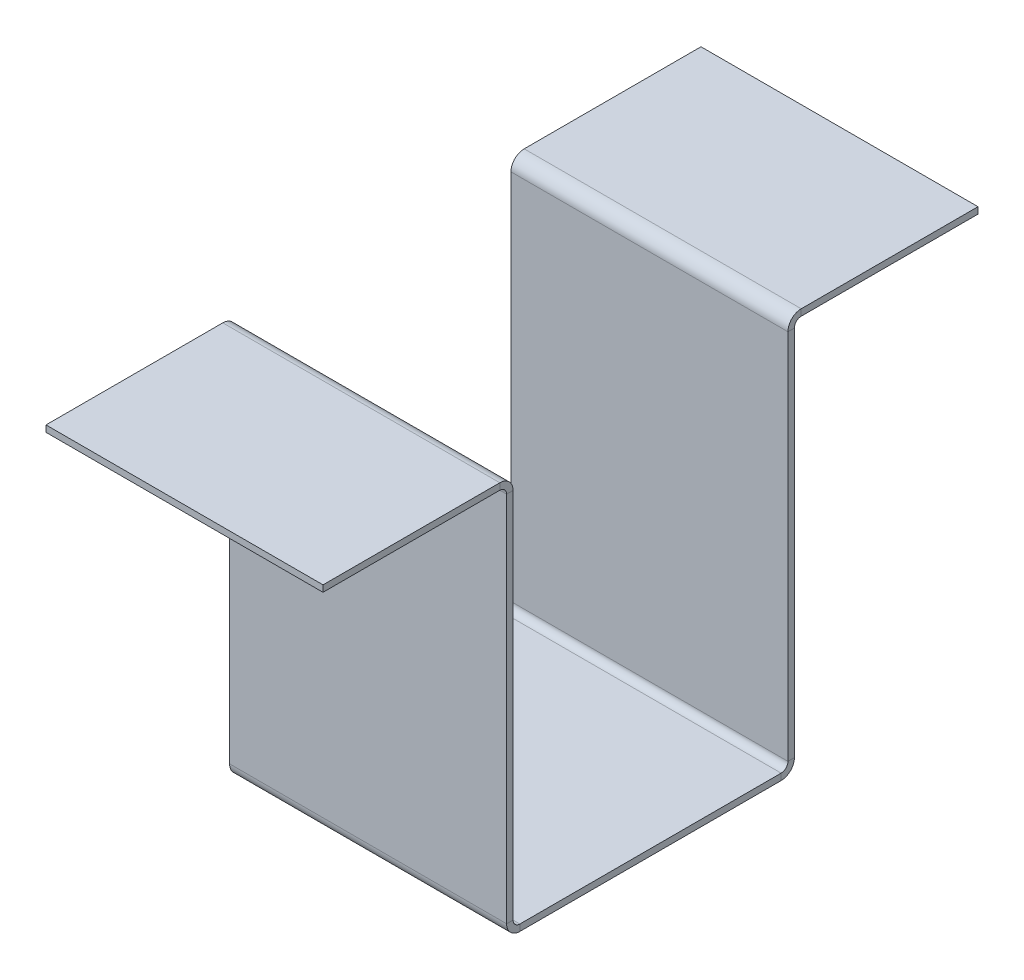
ISO-10303-21;
HEADER;
FILE_DESCRIPTION(('STEP AP214'),'2;1');
FILE_NAME('part.step','',(''),(''),'','','');
FILE_SCHEMA(('AUTOMOTIVE_DESIGN { 1 0 10303 214 1 1 1 1 }'));
ENDSEC;
DATA;
#1=APPLICATION_CONTEXT('core data for automotive mechanical design processes');
#2=APPLICATION_PROTOCOL_DEFINITION('international standard','automotive_design',2000,#1);
#3=PRODUCT_CONTEXT('',#1,'mechanical');
#4=PRODUCT('Part','Part','',(#3));
#5=PRODUCT_RELATED_PRODUCT_CATEGORY('part','',(#4));
#6=PRODUCT_DEFINITION_FORMATION('','',#4);
#7=PRODUCT_DEFINITION_CONTEXT('part definition',#1,'design');
#8=PRODUCT_DEFINITION('design','',#6,#7);
#9=PRODUCT_DEFINITION_SHAPE('','',#8);
#10=(LENGTH_UNIT() NAMED_UNIT(*) SI_UNIT(.MILLI.,.METRE.));
#11=(NAMED_UNIT(*) PLANE_ANGLE_UNIT() SI_UNIT($,.RADIAN.));
#12=(NAMED_UNIT(*) SI_UNIT($,.STERADIAN.) SOLID_ANGLE_UNIT());
#13=UNCERTAINTY_MEASURE_WITH_UNIT(LENGTH_MEASURE(1.E-05),#10,'distance_accuracy_value','');
#14=(GEOMETRIC_REPRESENTATION_CONTEXT(3) GLOBAL_UNCERTAINTY_ASSIGNED_CONTEXT((#13)) GLOBAL_UNIT_ASSIGNED_CONTEXT((#10,
#11,#12)) REPRESENTATION_CONTEXT('',''));
#15=CARTESIAN_POINT('',(0.,0.,0.));
#16=DIRECTION('',(0.,0.,1.));
#17=DIRECTION('',(1.,0.,0.));
#18=AXIS2_PLACEMENT_3D('',#15,#16,#17);
#19=CARTESIAN_POINT('',(0.,20.5831863556524,19.4168136443476));
#20=DIRECTION('',(0.,-1.,0.));
#21=DIRECTION('',(-1.,0.,0.));
#22=AXIS2_PLACEMENT_3D('',#19,#20,#21);
#23=PLANE('',#22);
#24=DIRECTION('',(0.,0.,-1.));
#25=VECTOR('',#24,1.);
#26=CARTESIAN_POINT('',(30.,20.5831863556524,19.4168136443477));
#27=LINE('',#26,#25);
#28=CARTESIAN_POINT('',(30.,20.5831863556522,-43.4366));
#29=VERTEX_POINT('',#28);
#30=CARTESIAN_POINT('',(30.,20.5831863556521,-71.7297727113047));
#31=VERTEX_POINT('',#30);
#32=EDGE_CURVE('E70',#29,#31,#27,.T.);
#33=ORIENTED_EDGE('',*,*,#32,.T.);
#34=DIRECTION('',(-1.,0.,0.));
#35=VECTOR('',#34,1.);
#36=CARTESIAN_POINT('',(0.,20.5831863556521,-71.7297727113047));
#37=LINE('',#36,#35);
#38=CARTESIAN_POINT('',(0.,20.5831863556521,-71.7297727113047));
#39=VERTEX_POINT('',#38);
#40=EDGE_CURVE('E62',#31,#39,#37,.T.);
#41=ORIENTED_EDGE('',*,*,#40,.T.);
#42=DIRECTION('',(0.,0.,1.));
#43=VECTOR('',#42,1.);
#44=CARTESIAN_POINT('',(0.,20.5831863556524,19.4168136443476));
#45=LINE('',#44,#43);
#46=CARTESIAN_POINT('',(0.,20.5831863556522,-43.4366));
#47=VERTEX_POINT('',#46);
#48=EDGE_CURVE('E78',#39,#47,#45,.T.);
#49=ORIENTED_EDGE('',*,*,#48,.T.);
#50=DIRECTION('',(-1.,0.,0.));
#51=VECTOR('',#50,1.);
#52=CARTESIAN_POINT('',(0.,20.5831863556522,-43.4366));
#53=LINE('',#52,#51);
#54=EDGE_CURVE('E384',#29,#47,#53,.T.);
#55=ORIENTED_EDGE('',*,*,#54,.F.);
#56=EDGE_LOOP('',(#33,#41,#49,#55));
#57=FACE_BOUND('',#56,.T.);
#58=ADVANCED_FACE('F53',(#57),#23,.F.);
#59=CARTESIAN_POINT('',(0.,19.8831863556524,19.4168136443477));
#60=DIRECTION('',(0.,-1.,0.));
#61=DIRECTION('',(-1.,0.,0.));
#62=AXIS2_PLACEMENT_3D('',#59,#60,#61);
#63=PLANE('',#62);
#64=DIRECTION('',(-1.,0.,0.));
#65=VECTOR('',#64,1.);
#66=CARTESIAN_POINT('',(0.,19.8831863556521,-71.7297727113047));
#67=LINE('',#66,#65);
#68=CARTESIAN_POINT('',(30.,19.8831863556521,-71.7297727113047));
#69=VERTEX_POINT('',#68);
#70=CARTESIAN_POINT('',(0.,19.8831863556521,-71.7297727113047));
#71=VERTEX_POINT('',#70);
#72=EDGE_CURVE('E388',#69,#71,#67,.T.);
#73=ORIENTED_EDGE('',*,*,#72,.F.);
#74=DIRECTION('',(0.,0.,-1.));
#75=VECTOR('',#74,1.);
#76=CARTESIAN_POINT('',(30.,19.8831863556524,19.4168136443477));
#77=LINE('',#76,#75);
#78=CARTESIAN_POINT('',(30.,19.8831863556522,-43.4366));
#79=VERTEX_POINT('',#78);
#80=EDGE_CURVE('E381',#79,#69,#77,.T.);
#81=ORIENTED_EDGE('',*,*,#80,.F.);
#82=DIRECTION('',(-1.,0.,0.));
#83=VECTOR('',#82,1.);
#84=CARTESIAN_POINT('',(0.,19.8831863556522,-43.4366));
#85=LINE('',#84,#83);
#86=CARTESIAN_POINT('',(0.,19.8831863556522,-43.4366));
#87=VERTEX_POINT('',#86);
#88=EDGE_CURVE('E377',#79,#87,#85,.T.);
#89=ORIENTED_EDGE('',*,*,#88,.T.);
#90=DIRECTION('',(0.,0.,1.));
#91=VECTOR('',#90,1.);
#92=CARTESIAN_POINT('',(0.,19.8831863556524,19.4168136443477));
#93=LINE('',#92,#91);
#94=EDGE_CURVE('E57',#71,#87,#93,.T.);
#95=ORIENTED_EDGE('',*,*,#94,.F.);
#96=EDGE_LOOP('',(#73,#81,#89,#95));
#97=FACE_BOUND('',#96,.T.);
#98=ADVANCED_FACE('F402',(#97),#63,.T.);
#99=CARTESIAN_POINT('',(30.,19.8831863556524,19.4168136443477));
#100=DIRECTION('',(1.,0.,0.));
#101=DIRECTION('',(0.,-1.,0.));
#102=AXIS2_PLACEMENT_3D('',#99,#100,#101);
#103=PLANE('',#102);
#104=DIRECTION('',(0.,-1.,0.));
#105=VECTOR('',#104,1.);
#106=CARTESIAN_POINT('',(30.,19.8831863556521,-71.7297727113047));
#107=LINE('',#106,#105);
#108=EDGE_CURVE('E12',#31,#69,#107,.T.);
#109=ORIENTED_EDGE('',*,*,#108,.F.);
#110=ORIENTED_EDGE('',*,*,#32,.F.);
#111=DIRECTION('',(0.,-1.,0.));
#112=VECTOR('',#111,1.);
#113=CARTESIAN_POINT('',(30.,19.8831863556522,-43.4366));
#114=LINE('',#113,#112);
#115=EDGE_CURVE('E380',#29,#79,#114,.T.);
#116=ORIENTED_EDGE('',*,*,#115,.T.);
#117=ORIENTED_EDGE('',*,*,#80,.T.);
#118=EDGE_LOOP('',(#109,#110,#116,#117));
#119=FACE_BOUND('',#118,.T.);
#120=ADVANCED_FACE('F55',(#119),#103,.T.);
#121=CARTESIAN_POINT('',(0.,19.8831863556524,19.4168136443477));
#122=DIRECTION('',(-1.,0.,0.));
#123=DIRECTION('',(0.,1.,0.));
#124=AXIS2_PLACEMENT_3D('',#121,#122,#123);
#125=PLANE('',#124);
#126=DIRECTION('',(0.,1.,0.));
#127=VECTOR('',#126,1.);
#128=CARTESIAN_POINT('',(0.,19.8831863556521,-71.7297727113047));
#129=LINE('',#128,#127);
#130=EDGE_CURVE('E391',#71,#39,#129,.T.);
#131=ORIENTED_EDGE('',*,*,#130,.F.);
#132=ORIENTED_EDGE('',*,*,#94,.T.);
#133=DIRECTION('',(0.,1.,0.));
#134=VECTOR('',#133,1.);
#135=CARTESIAN_POINT('',(0.,19.8831863556522,-43.4366));
#136=LINE('',#135,#134);
#137=EDGE_CURVE('E386',#87,#47,#136,.T.);
#138=ORIENTED_EDGE('',*,*,#137,.T.);
#139=ORIENTED_EDGE('',*,*,#48,.F.);
#140=EDGE_LOOP('',(#131,#132,#138,#139));
#141=FACE_BOUND('',#140,.T.);
#142=ADVANCED_FACE('F397',(#141),#125,.T.);
#143=CARTESIAN_POINT('',(30.,21.3197863556522,-43.4366));
#144=DIRECTION('',(1.,0.,0.));
#145=DIRECTION('',(0.,0.,-1.));
#146=AXIS2_PLACEMENT_3D('',#143,#144,#145);
#147=PLANE('',#146);
#148=ORIENTED_EDGE('',*,*,#115,.F.);
#149=CARTESIAN_POINT('',(30.,21.3197863556522,-43.4366));
#150=DIRECTION('',(-1.,0.,0.));
#151=DIRECTION('',(0.,-1.,0.));
#152=AXIS2_PLACEMENT_3D('',#149,#150,#151);
#153=CIRCLE('',#152,0.7366);
#154=CARTESIAN_POINT('',(30.,21.3197863556522,-42.7));
#155=VERTEX_POINT('',#154);
#156=EDGE_CURVE('E291',#29,#155,#153,.T.);
#157=ORIENTED_EDGE('',*,*,#156,.T.);
#158=DIRECTION('',(0.,0.,1.));
#159=VECTOR('',#158,1.);
#160=CARTESIAN_POINT('',(30.,21.3197863556522,-42.));
#161=LINE('',#160,#159);
#162=CARTESIAN_POINT('',(30.,21.3197863556522,-42.));
#163=VERTEX_POINT('',#162);
#164=EDGE_CURVE('E358',#155,#163,#161,.T.);
#165=ORIENTED_EDGE('',*,*,#164,.T.);
#166=CARTESIAN_POINT('',(30.,21.3197863556522,-43.4366));
#167=DIRECTION('',(-1.,0.,0.));
#168=DIRECTION('',(0.,0.,-1.));
#169=AXIS2_PLACEMENT_3D('',#166,#167,#168);
#170=CIRCLE('',#169,1.4366);
#171=EDGE_CURVE('E366',#79,#163,#170,.T.);
#172=ORIENTED_EDGE('',*,*,#171,.F.);
#173=EDGE_LOOP('',(#148,#157,#165,#172));
#174=FACE_BOUND('',#173,.T.);
#175=ADVANCED_FACE('F443',(#174),#147,.T.);
#176=CARTESIAN_POINT('',(0.,21.3197863556522,-43.4366));
#177=DIRECTION('',(-1.,0.,0.));
#178=DIRECTION('',(0.,-1.,0.));
#179=AXIS2_PLACEMENT_3D('',#176,#177,#178);
#180=PLANE('',#179);
#181=DIRECTION('',(0.,0.,-1.));
#182=VECTOR('',#181,1.);
#183=CARTESIAN_POINT('',(0.,21.3197863556522,-42.));
#184=LINE('',#183,#182);
#185=CARTESIAN_POINT('',(0.,21.3197863556522,-42.));
#186=VERTEX_POINT('',#185);
#187=CARTESIAN_POINT('',(0.,21.3197863556522,-42.7));
#188=VERTEX_POINT('',#187);
#189=EDGE_CURVE('E361',#186,#188,#184,.T.);
#190=ORIENTED_EDGE('',*,*,#189,.T.);
#191=CARTESIAN_POINT('',(0.,21.3197863556522,-43.4366));
#192=DIRECTION('',(-1.,0.,0.));
#193=DIRECTION('',(0.,-1.,0.));
#194=AXIS2_PLACEMENT_3D('',#191,#192,#193);
#195=CIRCLE('',#194,0.7366);
#196=EDGE_CURVE('E370',#188,#47,#195,.F.);
#197=ORIENTED_EDGE('',*,*,#196,.T.);
#198=ORIENTED_EDGE('',*,*,#137,.F.);
#199=CARTESIAN_POINT('',(0.,21.3197863556522,-43.4366));
#200=DIRECTION('',(1.,0.,0.));
#201=DIRECTION('',(0.,-1.,0.));
#202=AXIS2_PLACEMENT_3D('',#199,#200,#201);
#203=CIRCLE('',#202,1.4366);
#204=EDGE_CURVE('E369',#186,#87,#203,.T.);
#205=ORIENTED_EDGE('',*,*,#204,.F.);
#206=EDGE_LOOP('',(#190,#197,#198,#205));
#207=FACE_BOUND('',#206,.T.);
#208=ADVANCED_FACE('F407',(#207),#180,.T.);
#209=CARTESIAN_POINT('',(45.0566674698549,21.3197863556522,-43.4366));
#210=DIRECTION('',(-1.,0.,0.));
#211=DIRECTION('',(0.,-1.,0.));
#212=AXIS2_PLACEMENT_3D('',#209,#210,#211);
#213=CYLINDRICAL_SURFACE('',#212,1.4366);
#214=ORIENTED_EDGE('',*,*,#204,.T.);
#215=ORIENTED_EDGE('',*,*,#88,.F.);
#216=ORIENTED_EDGE('',*,*,#171,.T.);
#217=DIRECTION('',(-1.,0.,0.));
#218=VECTOR('',#217,1.);
#219=CARTESIAN_POINT('',(0.,21.3197863556522,-42.));
#220=LINE('',#219,#218);
#221=EDGE_CURVE('E284',#163,#186,#220,.T.);
#222=ORIENTED_EDGE('',*,*,#221,.T.);
#223=EDGE_LOOP('',(#214,#215,#216,#222));
#224=FACE_BOUND('',#223,.T.);
#225=ADVANCED_FACE('F404',(#224),#213,.T.);
#226=CARTESIAN_POINT('',(45.0566674698549,21.3197863556522,-43.4366));
#227=DIRECTION('',(-1.,0.,0.));
#228=DIRECTION('',(0.,-1.,0.));
#229=AXIS2_PLACEMENT_3D('',#226,#227,#228);
#230=CYLINDRICAL_SURFACE('',#229,0.7366);
#231=ORIENTED_EDGE('',*,*,#196,.F.);
#232=DIRECTION('',(-1.,0.,0.));
#233=VECTOR('',#232,1.);
#234=CARTESIAN_POINT('',(0.,21.3197863556522,-42.7));
#235=LINE('',#234,#233);
#236=EDGE_CURVE('E297',#155,#188,#235,.T.);
#237=ORIENTED_EDGE('',*,*,#236,.F.);
#238=ORIENTED_EDGE('',*,*,#156,.F.);
#239=ORIENTED_EDGE('',*,*,#54,.T.);
#240=EDGE_LOOP('',(#231,#237,#238,#239));
#241=FACE_BOUND('',#240,.T.);
#242=ADVANCED_FACE('F444',(#241),#230,.F.);
#243=CARTESIAN_POINT('',(0.,62.3495590669569,-22.116813644348));
#244=DIRECTION('',(0.,0.,1.));
#245=DIRECTION('',(0.,-1.,0.));
#246=AXIS2_PLACEMENT_3D('',#243,#244,#245);
#247=PLANE('',#246);
#248=DIRECTION('',(1.,0.,0.));
#249=VECTOR('',#248,1.);
#250=CARTESIAN_POINT('',(0.,63.0495590669569,-22.116813644348));
#251=LINE('',#250,#249);
#252=CARTESIAN_POINT('',(0.,63.0495590669569,-22.116813644348));
#253=VERTEX_POINT('',#252);
#254=CARTESIAN_POINT('',(30.,63.0495590669569,-22.116813644348));
#255=VERTEX_POINT('',#254);
#256=EDGE_CURVE('E340',#253,#255,#251,.T.);
#257=ORIENTED_EDGE('',*,*,#256,.F.);
#258=DIRECTION('',(0.,1.,0.));
#259=VECTOR('',#258,1.);
#260=CARTESIAN_POINT('',(0.,62.3495590669569,-22.116813644348));
#261=LINE('',#260,#259);
#262=CARTESIAN_POINT('',(0.,62.3495590669569,-22.116813644348));
#263=VERTEX_POINT('',#262);
#264=EDGE_CURVE('E345',#263,#253,#261,.T.);
#265=ORIENTED_EDGE('',*,*,#264,.F.);
#266=DIRECTION('',(1.,0.,0.));
#267=VECTOR('',#266,1.);
#268=CARTESIAN_POINT('',(0.,62.3495590669569,-22.116813644348));
#269=LINE('',#268,#267);
#270=CARTESIAN_POINT('',(30.,62.3495590669569,-22.116813644348));
#271=VERTEX_POINT('',#270);
#272=EDGE_CURVE('E355',#263,#271,#269,.T.);
#273=ORIENTED_EDGE('',*,*,#272,.T.);
#274=DIRECTION('',(0.,1.,0.));
#275=VECTOR('',#274,1.);
#276=CARTESIAN_POINT('',(30.,62.3495590669569,-22.116813644348));
#277=LINE('',#276,#275);
#278=EDGE_CURVE('E353',#271,#255,#277,.T.);
#279=ORIENTED_EDGE('',*,*,#278,.T.);
#280=EDGE_LOOP('',(#257,#265,#273,#279));
#281=FACE_BOUND('',#280,.T.);
#282=ADVANCED_FACE('F475',(#281),#247,.T.);
#283=CARTESIAN_POINT('',(0.,62.3495590669569,-22.116813644348));
#284=DIRECTION('',(-1.,0.,0.));
#285=DIRECTION('',(0.,1.,0.));
#286=AXIS2_PLACEMENT_3D('',#283,#284,#285);
#287=PLANE('',#286);
#288=DIRECTION('',(0.,0.,1.));
#289=VECTOR('',#288,1.);
#290=CARTESIAN_POINT('',(0.,63.0495590669569,-22.116813644348));
#291=LINE('',#290,#289);
#292=CARTESIAN_POINT('',(0.,63.0495590669568,-41.2634000000003));
#293=VERTEX_POINT('',#292);
#294=EDGE_CURVE('E343',#293,#253,#291,.T.);
#295=ORIENTED_EDGE('',*,*,#294,.F.);
#296=DIRECTION('',(0.,-1.,0.));
#297=VECTOR('',#296,1.);
#298=CARTESIAN_POINT('',(0.,62.349559066957,-41.2634000000003));
#299=LINE('',#298,#297);
#300=CARTESIAN_POINT('',(0.,62.3495590669569,-41.2634000000003));
#301=VERTEX_POINT('',#300);
#302=EDGE_CURVE('E350',#293,#301,#299,.T.);
#303=ORIENTED_EDGE('',*,*,#302,.T.);
#304=DIRECTION('',(0.,0.,1.));
#305=VECTOR('',#304,1.);
#306=CARTESIAN_POINT('',(0.,62.3495590669569,-22.116813644348));
#307=LINE('',#306,#305);
#308=EDGE_CURVE('E348',#301,#263,#307,.T.);
#309=ORIENTED_EDGE('',*,*,#308,.T.);
#310=ORIENTED_EDGE('',*,*,#264,.T.);
#311=EDGE_LOOP('',(#295,#303,#309,#310));
#312=FACE_BOUND('',#311,.T.);
#313=ADVANCED_FACE('F478',(#312),#287,.T.);
#314=CARTESIAN_POINT('',(0.,63.0495590669569,-22.116813644348));
#315=DIRECTION('',(0.,-1.,0.));
#316=DIRECTION('',(-1.,0.,0.));
#317=AXIS2_PLACEMENT_3D('',#314,#315,#316);
#318=PLANE('',#317);
#319=DIRECTION('',(1.,0.,0.));
#320=VECTOR('',#319,1.);
#321=CARTESIAN_POINT('',(0.,63.0495590669568,-41.2634000000003));
#322=LINE('',#321,#320);
#323=CARTESIAN_POINT('',(30.,63.0495590669569,-41.2634000000003));
#324=VERTEX_POINT('',#323);
#325=EDGE_CURVE('E319',#293,#324,#322,.T.);
#326=ORIENTED_EDGE('',*,*,#325,.F.);
#327=ORIENTED_EDGE('',*,*,#294,.T.);
#328=ORIENTED_EDGE('',*,*,#256,.T.);
#329=DIRECTION('',(0.,0.,-1.));
#330=VECTOR('',#329,1.);
#331=CARTESIAN_POINT('',(30.,63.0495590669569,-22.116813644348));
#332=LINE('',#331,#330);
#333=EDGE_CURVE('E337',#255,#324,#332,.T.);
#334=ORIENTED_EDGE('',*,*,#333,.T.);
#335=EDGE_LOOP('',(#326,#327,#328,#334));
#336=FACE_BOUND('',#335,.T.);
#337=ADVANCED_FACE('F486',(#336),#318,.F.);
#338=CARTESIAN_POINT('',(30.,62.3495590669569,-22.116813644348));
#339=DIRECTION('',(1.,0.,0.));
#340=DIRECTION('',(0.,-1.,0.));
#341=AXIS2_PLACEMENT_3D('',#338,#339,#340);
#342=PLANE('',#341);
#343=DIRECTION('',(0.,0.,-1.));
#344=VECTOR('',#343,1.);
#345=CARTESIAN_POINT('',(30.,62.3495590669569,-22.116813644348));
#346=LINE('',#345,#344);
#347=CARTESIAN_POINT('',(30.,62.3495590669569,-41.2634000000003));
#348=VERTEX_POINT('',#347);
#349=EDGE_CURVE('E334',#271,#348,#346,.T.);
#350=ORIENTED_EDGE('',*,*,#349,.T.);
#351=DIRECTION('',(0.,1.,0.));
#352=VECTOR('',#351,1.);
#353=CARTESIAN_POINT('',(30.,62.349559066957,-41.2634000000003));
#354=LINE('',#353,#352);
#355=EDGE_CURVE('E331',#348,#324,#354,.T.);
#356=ORIENTED_EDGE('',*,*,#355,.T.);
#357=ORIENTED_EDGE('',*,*,#333,.F.);
#358=ORIENTED_EDGE('',*,*,#278,.F.);
#359=EDGE_LOOP('',(#350,#356,#357,#358));
#360=FACE_BOUND('',#359,.T.);
#361=ADVANCED_FACE('F466',(#360),#342,.T.);
#362=CARTESIAN_POINT('',(0.,62.3495590669569,-22.116813644348));
#363=DIRECTION('',(0.,-1.,0.));
#364=DIRECTION('',(-1.,0.,0.));
#365=AXIS2_PLACEMENT_3D('',#362,#363,#364);
#366=PLANE('',#365);
#367=ORIENTED_EDGE('',*,*,#308,.F.);
#368=DIRECTION('',(1.,0.,0.));
#369=VECTOR('',#368,1.);
#370=CARTESIAN_POINT('',(0.,62.3495590669569,-41.2634000000003));
#371=LINE('',#370,#369);
#372=EDGE_CURVE('E328',#301,#348,#371,.T.);
#373=ORIENTED_EDGE('',*,*,#372,.T.);
#374=ORIENTED_EDGE('',*,*,#349,.F.);
#375=ORIENTED_EDGE('',*,*,#272,.F.);
#376=EDGE_LOOP('',(#367,#373,#374,#375));
#377=FACE_BOUND('',#376,.T.);
#378=ADVANCED_FACE('F471',(#377),#366,.T.);
#379=CARTESIAN_POINT('',(0.,61.6129590669569,-41.2634000000003));
#380=DIRECTION('',(1.,0.,0.));
#381=DIRECTION('',(0.,0.,-1.));
#382=AXIS2_PLACEMENT_3D('',#379,#380,#381);
#383=PLANE('',#382);
#384=ORIENTED_EDGE('',*,*,#302,.F.);
#385=CARTESIAN_POINT('',(0.,61.6129590669569,-41.2634000000003));
#386=DIRECTION('',(1.,0.,0.));
#387=DIRECTION('',(0.,0.,-1.));
#388=AXIS2_PLACEMENT_3D('',#385,#386,#387);
#389=CIRCLE('',#388,1.4366);
#390=CARTESIAN_POINT('',(0.,61.6129590669568,-42.7000000000003));
#391=VERTEX_POINT('',#390);
#392=EDGE_CURVE('E325',#293,#391,#389,.F.);
#393=ORIENTED_EDGE('',*,*,#392,.T.);
#394=DIRECTION('',(0.,0.,1.));
#395=VECTOR('',#394,1.);
#396=CARTESIAN_POINT('',(0.,61.6129590669568,-42.0000000000005));
#397=LINE('',#396,#395);
#398=CARTESIAN_POINT('',(0.,61.6129590669568,-42.0000000000003));
#399=VERTEX_POINT('',#398);
#400=EDGE_CURVE('E322',#391,#399,#397,.T.);
#401=ORIENTED_EDGE('',*,*,#400,.T.);
#402=CARTESIAN_POINT('',(0.,61.6129590669569,-41.2634000000003));
#403=DIRECTION('',(-1.,0.,0.));
#404=DIRECTION('',(0.,0.,-1.));
#405=AXIS2_PLACEMENT_3D('',#402,#403,#404);
#406=CIRCLE('',#405,0.736600000000002);
#407=EDGE_CURVE('E305',#301,#399,#406,.T.);
#408=ORIENTED_EDGE('',*,*,#407,.F.);
#409=EDGE_LOOP('',(#384,#393,#401,#408));
#410=FACE_BOUND('',#409,.T.);
#411=ADVANCED_FACE('F482',(#410),#383,.F.);
#412=CARTESIAN_POINT('',(-15.0566674698549,61.6129590669568,-41.2634000000003));
#413=DIRECTION('',(1.,0.,0.));
#414=DIRECTION('',(0.,0.,-1.));
#415=AXIS2_PLACEMENT_3D('',#412,#413,#414);
#416=CYLINDRICAL_SURFACE('',#415,1.4366);
#417=DIRECTION('',(1.,0.,0.));
#418=VECTOR('',#417,1.);
#419=CARTESIAN_POINT('',(0.,61.6129590669568,-42.7000000000003));
#420=LINE('',#419,#418);
#421=CARTESIAN_POINT('',(30.,61.6129590669569,-42.7000000000003));
#422=VERTEX_POINT('',#421);
#423=EDGE_CURVE('E292',#391,#422,#420,.T.);
#424=ORIENTED_EDGE('',*,*,#423,.F.);
#425=ORIENTED_EDGE('',*,*,#392,.F.);
#426=ORIENTED_EDGE('',*,*,#325,.T.);
#427=CARTESIAN_POINT('',(30.,61.6129590669569,-41.2634000000003));
#428=DIRECTION('',(1.,0.,0.));
#429=DIRECTION('',(0.,0.,-1.));
#430=AXIS2_PLACEMENT_3D('',#427,#428,#429);
#431=CIRCLE('',#430,1.4366);
#432=EDGE_CURVE('E317',#422,#324,#431,.T.);
#433=ORIENTED_EDGE('',*,*,#432,.F.);
#434=EDGE_LOOP('',(#424,#425,#426,#433));
#435=FACE_BOUND('',#434,.T.);
#436=ADVANCED_FACE('F484',(#435),#416,.T.);
#437=CARTESIAN_POINT('',(30.,61.6129590669569,-41.2634000000003));
#438=DIRECTION('',(-1.,0.,0.));
#439=DIRECTION('',(0.,1.,0.));
#440=AXIS2_PLACEMENT_3D('',#437,#438,#439);
#441=PLANE('',#440);
#442=ORIENTED_EDGE('',*,*,#432,.T.);
#443=ORIENTED_EDGE('',*,*,#355,.F.);
#444=CARTESIAN_POINT('',(30.,61.6129590669569,-41.2634000000003));
#445=DIRECTION('',(1.,0.,0.));
#446=DIRECTION('',(0.,1.,0.));
#447=AXIS2_PLACEMENT_3D('',#444,#445,#446);
#448=CIRCLE('',#447,0.7366);
#449=CARTESIAN_POINT('',(30.,61.6129590669569,-42.0000000000003));
#450=VERTEX_POINT('',#449);
#451=EDGE_CURVE('E308',#450,#348,#448,.T.);
#452=ORIENTED_EDGE('',*,*,#451,.F.);
#453=DIRECTION('',(0.,0.,-1.));
#454=VECTOR('',#453,1.);
#455=CARTESIAN_POINT('',(30.,61.6129590669569,-42.0000000000005));
#456=LINE('',#455,#454);
#457=EDGE_CURVE('E314',#450,#422,#456,.T.);
#458=ORIENTED_EDGE('',*,*,#457,.T.);
#459=EDGE_LOOP('',(#442,#443,#452,#458));
#460=FACE_BOUND('',#459,.T.);
#461=ADVANCED_FACE('F462',(#460),#441,.F.);
#462=CARTESIAN_POINT('',(-15.0566674698549,61.6129590669568,-41.2634000000003));
#463=DIRECTION('',(1.,0.,0.));
#464=DIRECTION('',(0.,0.,-1.));
#465=AXIS2_PLACEMENT_3D('',#462,#463,#464);
#466=CYLINDRICAL_SURFACE('',#465,0.7366);
#467=DIRECTION('',(1.,0.,0.));
#468=VECTOR('',#467,1.);
#469=CARTESIAN_POINT('',(0.,61.6129590669568,-42.0000000000003));
#470=LINE('',#469,#468);
#471=EDGE_CURVE('E311',#399,#450,#470,.T.);
#472=ORIENTED_EDGE('',*,*,#471,.T.);
#473=ORIENTED_EDGE('',*,*,#451,.T.);
#474=ORIENTED_EDGE('',*,*,#372,.F.);
#475=ORIENTED_EDGE('',*,*,#407,.T.);
#476=EDGE_LOOP('',(#472,#473,#474,#475));
#477=FACE_BOUND('',#476,.T.);
#478=ADVANCED_FACE('F459',(#477),#466,.F.);
#479=CARTESIAN_POINT('',(0.,82.4663727113045,-42.0000000000005));
#480=DIRECTION('',(0.,0.,1.));
#481=DIRECTION('',(-1.,0.,0.));
#482=AXIS2_PLACEMENT_3D('',#479,#480,#481);
#483=PLANE('',#482);
#484=ORIENTED_EDGE('',*,*,#221,.F.);
#485=DIRECTION('',(0.,-1.,0.));
#486=VECTOR('',#485,1.);
#487=CARTESIAN_POINT('',(30.,82.4663727113045,-42.0000000000005));
#488=LINE('',#487,#486);
#489=EDGE_CURVE('E302',#450,#163,#488,.T.);
#490=ORIENTED_EDGE('',*,*,#489,.F.);
#491=ORIENTED_EDGE('',*,*,#471,.F.);
#492=DIRECTION('',(0.,1.,0.));
#493=VECTOR('',#492,1.);
#494=CARTESIAN_POINT('',(0.,82.4663727113045,-42.0000000000005));
#495=LINE('',#494,#493);
#496=EDGE_CURVE('E289',#186,#399,#495,.T.);
#497=ORIENTED_EDGE('',*,*,#496,.F.);
#498=EDGE_LOOP('',(#484,#490,#491,#497));
#499=FACE_BOUND('',#498,.T.);
#500=ADVANCED_FACE('F455',(#499),#483,.T.);
#501=CARTESIAN_POINT('',(30.,82.4663727113045,-42.0000000000005));
#502=DIRECTION('',(1.,0.,0.));
#503=DIRECTION('',(0.,0.,1.));
#504=AXIS2_PLACEMENT_3D('',#501,#502,#503);
#505=PLANE('',#504);
#506=ORIENTED_EDGE('',*,*,#164,.F.);
#507=DIRECTION('',(0.,-1.,0.));
#508=VECTOR('',#507,1.);
#509=CARTESIAN_POINT('',(30.,82.4663727113045,-42.7000000000005));
#510=LINE('',#509,#508);
#511=EDGE_CURVE('E300',#422,#155,#510,.T.);
#512=ORIENTED_EDGE('',*,*,#511,.F.);
#513=ORIENTED_EDGE('',*,*,#457,.F.);
#514=ORIENTED_EDGE('',*,*,#489,.T.);
#515=EDGE_LOOP('',(#506,#512,#513,#514));
#516=FACE_BOUND('',#515,.T.);
#517=ADVANCED_FACE('F451',(#516),#505,.T.);
#518=CARTESIAN_POINT('',(0.,82.4663727113045,-42.7000000000005));
#519=DIRECTION('',(0.,0.,1.));
#520=DIRECTION('',(-1.,0.,0.));
#521=AXIS2_PLACEMENT_3D('',#518,#519,#520);
#522=PLANE('',#521);
#523=ORIENTED_EDGE('',*,*,#511,.T.);
#524=ORIENTED_EDGE('',*,*,#236,.T.);
#525=DIRECTION('',(0.,1.,0.));
#526=VECTOR('',#525,1.);
#527=CARTESIAN_POINT('',(0.,82.4663727113045,-42.7000000000005));
#528=LINE('',#527,#526);
#529=EDGE_CURVE('E295',#188,#391,#528,.T.);
#530=ORIENTED_EDGE('',*,*,#529,.T.);
#531=ORIENTED_EDGE('',*,*,#423,.T.);
#532=EDGE_LOOP('',(#523,#524,#530,#531));
#533=FACE_BOUND('',#532,.T.);
#534=ADVANCED_FACE('F446',(#533),#522,.F.);
#535=CARTESIAN_POINT('',(0.,82.4663727113045,-42.0000000000005));
#536=DIRECTION('',(-1.,0.,0.));
#537=DIRECTION('',(0.,0.,-1.));
#538=AXIS2_PLACEMENT_3D('',#535,#536,#537);
#539=PLANE('',#538);
#540=ORIENTED_EDGE('',*,*,#189,.F.);
#541=ORIENTED_EDGE('',*,*,#496,.T.);
#542=ORIENTED_EDGE('',*,*,#400,.F.);
#543=ORIENTED_EDGE('',*,*,#529,.F.);
#544=EDGE_LOOP('',(#540,#541,#542,#543));
#545=FACE_BOUND('',#544,.T.);
#546=ADVANCED_FACE('F511',(#545),#539,.T.);
#547=CARTESIAN_POINT('',(30.,21.3197863556521,-71.7297727113047));
#548=DIRECTION('',(1.,0.,0.));
#549=DIRECTION('',(0.,0.,-1.));
#550=AXIS2_PLACEMENT_3D('',#547,#548,#549);
#551=PLANE('',#550);
#552=DIRECTION('',(0.,0.,-1.));
#553=VECTOR('',#552,1.);
#554=CARTESIAN_POINT('',(30.,21.3197863556521,-73.1663727113047));
#555=LINE('',#554,#553);
#556=CARTESIAN_POINT('',(30.,21.3197863556521,-72.4663727113047));
#557=VERTEX_POINT('',#556);
#558=CARTESIAN_POINT('',(30.,21.3197863556521,-73.1663727113047));
#559=VERTEX_POINT('',#558);
#560=EDGE_CURVE('E200',#557,#559,#555,.T.);
#561=ORIENTED_EDGE('',*,*,#560,.F.);
#562=CARTESIAN_POINT('',(30.,21.3197863556521,-71.7297727113047));
#563=DIRECTION('',(1.,0.,0.));
#564=DIRECTION('',(0.,1.,0.));
#565=AXIS2_PLACEMENT_3D('',#562,#563,#564);
#566=CIRCLE('',#565,0.7366);
#567=EDGE_CURVE('E215',#557,#31,#566,.F.);
#568=ORIENTED_EDGE('',*,*,#567,.T.);
#569=ORIENTED_EDGE('',*,*,#108,.T.);
#570=CARTESIAN_POINT('',(30.,21.3197863556521,-71.7297727113047));
#571=DIRECTION('',(-1.,0.,0.));
#572=DIRECTION('',(0.,0.,-1.));
#573=AXIS2_PLACEMENT_3D('',#570,#571,#572);
#574=CIRCLE('',#573,1.4366);
#575=EDGE_CURVE('E277',#559,#69,#574,.T.);
#576=ORIENTED_EDGE('',*,*,#575,.F.);
#577=EDGE_LOOP('',(#561,#568,#569,#576));
#578=FACE_BOUND('',#577,.T.);
#579=ADVANCED_FACE('F430',(#578),#551,.T.);
#580=CARTESIAN_POINT('',(0.,21.3197863556521,-71.7297727113047));
#581=DIRECTION('',(-1.,0.,0.));
#582=DIRECTION('',(0.,-1.,0.));
#583=AXIS2_PLACEMENT_3D('',#580,#581,#582);
#584=PLANE('',#583);
#585=CARTESIAN_POINT('',(0.,21.3197863556521,-71.7297727113047));
#586=DIRECTION('',(1.,0.,0.));
#587=DIRECTION('',(0.,1.,0.));
#588=AXIS2_PLACEMENT_3D('',#585,#586,#587);
#589=CIRCLE('',#588,0.7366);
#590=CARTESIAN_POINT('',(0.,21.3197863556521,-72.4663727113047));
#591=VERTEX_POINT('',#590);
#592=EDGE_CURVE('E281',#39,#591,#589,.T.);
#593=ORIENTED_EDGE('',*,*,#592,.T.);
#594=DIRECTION('',(0.,0.,1.));
#595=VECTOR('',#594,1.);
#596=CARTESIAN_POINT('',(0.,21.3197863556521,-73.1663727113047));
#597=LINE('',#596,#595);
#598=CARTESIAN_POINT('',(0.,21.3197863556521,-73.1663727113047));
#599=VERTEX_POINT('',#598);
#600=EDGE_CURVE('E233',#599,#591,#597,.T.);
#601=ORIENTED_EDGE('',*,*,#600,.F.);
#602=CARTESIAN_POINT('',(0.,21.3197863556521,-71.7297727113047));
#603=DIRECTION('',(1.,0.,0.));
#604=DIRECTION('',(0.,-1.,0.));
#605=AXIS2_PLACEMENT_3D('',#602,#603,#604);
#606=CIRCLE('',#605,1.4366);
#607=EDGE_CURVE('E280',#71,#599,#606,.T.);
#608=ORIENTED_EDGE('',*,*,#607,.F.);
#609=ORIENTED_EDGE('',*,*,#130,.T.);
#610=EDGE_LOOP('',(#593,#601,#608,#609));
#611=FACE_BOUND('',#610,.T.);
#612=ADVANCED_FACE('F417',(#611),#584,.T.);
#613=CARTESIAN_POINT('',(-15.0566674698549,21.3197863556521,-71.7297727113047));
#614=DIRECTION('',(1.,0.,0.));
#615=DIRECTION('',(0.,1.,0.));
#616=AXIS2_PLACEMENT_3D('',#613,#614,#615);
#617=CYLINDRICAL_SURFACE('',#616,1.4366);
#618=ORIENTED_EDGE('',*,*,#72,.T.);
#619=ORIENTED_EDGE('',*,*,#607,.T.);
#620=DIRECTION('',(-1.,0.,0.));
#621=VECTOR('',#620,1.);
#622=CARTESIAN_POINT('',(0.,21.3197863556521,-73.1663727113047));
#623=LINE('',#622,#621);
#624=EDGE_CURVE('E231',#559,#599,#623,.T.);
#625=ORIENTED_EDGE('',*,*,#624,.F.);
#626=ORIENTED_EDGE('',*,*,#575,.T.);
#627=EDGE_LOOP('',(#618,#619,#625,#626));
#628=FACE_BOUND('',#627,.T.);
#629=ADVANCED_FACE('F439',(#628),#617,.T.);
#630=CARTESIAN_POINT('',(-15.0566674698549,21.3197863556521,-71.7297727113047));
#631=DIRECTION('',(1.,0.,0.));
#632=DIRECTION('',(0.,1.,0.));
#633=AXIS2_PLACEMENT_3D('',#630,#631,#632);
#634=CYLINDRICAL_SURFACE('',#633,0.7366);
#635=ORIENTED_EDGE('',*,*,#40,.F.);
#636=ORIENTED_EDGE('',*,*,#567,.F.);
#637=DIRECTION('',(-1.,0.,0.));
#638=VECTOR('',#637,1.);
#639=CARTESIAN_POINT('',(0.,21.3197863556521,-72.4663727113047));
#640=LINE('',#639,#638);
#641=EDGE_CURVE('E274',#557,#591,#640,.T.);
#642=ORIENTED_EDGE('',*,*,#641,.T.);
#643=ORIENTED_EDGE('',*,*,#592,.F.);
#644=EDGE_LOOP('',(#635,#636,#642,#643));
#645=FACE_BOUND('',#644,.T.);
#646=ADVANCED_FACE('F419',(#645),#634,.F.);
#647=CARTESIAN_POINT('',(0.,62.3495590669566,-93.049559066957));
#648=DIRECTION('',(0.,0.,-1.));
#649=DIRECTION('',(0.,1.,0.));
#650=AXIS2_PLACEMENT_3D('',#647,#648,#649);
#651=PLANE('',#650);
#652=DIRECTION('',(-1.,0.,0.));
#653=VECTOR('',#652,1.);
#654=CARTESIAN_POINT('',(0.,63.0495590669567,-93.049559066957));
#655=LINE('',#654,#653);
#656=CARTESIAN_POINT('',(30.,63.0495590669567,-93.049559066957));
#657=VERTEX_POINT('',#656);
#658=CARTESIAN_POINT('',(0.,63.0495590669567,-93.049559066957));
#659=VERTEX_POINT('',#658);
#660=EDGE_CURVE('E254',#657,#659,#655,.T.);
#661=ORIENTED_EDGE('',*,*,#660,.F.);
#662=DIRECTION('',(0.,1.,0.));
#663=VECTOR('',#662,1.);
#664=CARTESIAN_POINT('',(30.,62.3495590669567,-93.049559066957));
#665=LINE('',#664,#663);
#666=CARTESIAN_POINT('',(30.,62.3495590669567,-93.049559066957));
#667=VERTEX_POINT('',#666);
#668=EDGE_CURVE('E264',#667,#657,#665,.T.);
#669=ORIENTED_EDGE('',*,*,#668,.F.);
#670=DIRECTION('',(-1.,0.,0.));
#671=VECTOR('',#670,1.);
#672=CARTESIAN_POINT('',(0.,62.3495590669566,-93.049559066957));
#673=LINE('',#672,#671);
#674=CARTESIAN_POINT('',(0.,62.3495590669566,-93.049559066957));
#675=VERTEX_POINT('',#674);
#676=EDGE_CURVE('E271',#667,#675,#673,.T.);
#677=ORIENTED_EDGE('',*,*,#676,.T.);
#678=DIRECTION('',(0.,1.,0.));
#679=VECTOR('',#678,1.);
#680=CARTESIAN_POINT('',(0.,62.3495590669566,-93.049559066957));
#681=LINE('',#680,#679);
#682=EDGE_CURVE('E269',#675,#659,#681,.T.);
#683=ORIENTED_EDGE('',*,*,#682,.T.);
#684=EDGE_LOOP('',(#661,#669,#677,#683));
#685=FACE_BOUND('',#684,.T.);
#686=ADVANCED_FACE('F590',(#685),#651,.T.);
#687=CARTESIAN_POINT('',(30.,62.3495590669572,60.950440933043));
#688=DIRECTION('',(1.,0.,0.));
#689=DIRECTION('',(0.,-1.,0.));
#690=AXIS2_PLACEMENT_3D('',#687,#688,#689);
#691=PLANE('',#690);
#692=DIRECTION('',(0.,1.,0.));
#693=VECTOR('',#692,1.);
#694=CARTESIAN_POINT('',(30.,62.3495590669577,-73.9029727113047));
#695=LINE('',#694,#693);
#696=CARTESIAN_POINT('',(30.,62.3495590669568,-73.9029727113047));
#697=VERTEX_POINT('',#696);
#698=CARTESIAN_POINT('',(30.,63.0495590669567,-73.9029727113047));
#699=VERTEX_POINT('',#698);
#700=EDGE_CURVE('E248',#697,#699,#695,.T.);
#701=ORIENTED_EDGE('',*,*,#700,.F.);
#702=DIRECTION('',(0.,0.,-1.));
#703=VECTOR('',#702,1.);
#704=CARTESIAN_POINT('',(30.,62.3495590669572,60.950440933043));
#705=LINE('',#704,#703);
#706=EDGE_CURVE('E267',#697,#667,#705,.T.);
#707=ORIENTED_EDGE('',*,*,#706,.T.);
#708=ORIENTED_EDGE('',*,*,#668,.T.);
#709=DIRECTION('',(0.,0.,-1.));
#710=VECTOR('',#709,1.);
#711=CARTESIAN_POINT('',(30.,63.0495590669572,60.950440933043));
#712=LINE('',#711,#710);
#713=EDGE_CURVE('E257',#699,#657,#712,.T.);
#714=ORIENTED_EDGE('',*,*,#713,.F.);
#715=EDGE_LOOP('',(#701,#707,#708,#714));
#716=FACE_BOUND('',#715,.T.);
#717=ADVANCED_FACE('F597',(#716),#691,.T.);
#718=CARTESIAN_POINT('',(0.,63.0495590669572,60.950440933043));
#719=DIRECTION('',(0.,-1.,0.));
#720=DIRECTION('',(-1.,0.,0.));
#721=AXIS2_PLACEMENT_3D('',#718,#719,#720);
#722=PLANE('',#721);
#723=DIRECTION('',(0.,0.,1.));
#724=VECTOR('',#723,1.);
#725=CARTESIAN_POINT('',(0.,63.0495590669572,60.950440933043));
#726=LINE('',#725,#724);
#727=CARTESIAN_POINT('',(0.,63.0495590669567,-73.9029727113047));
#728=VERTEX_POINT('',#727);
#729=EDGE_CURVE('E262',#659,#728,#726,.T.);
#730=ORIENTED_EDGE('',*,*,#729,.T.);
#731=DIRECTION('',(1.,0.,0.));
#732=VECTOR('',#731,1.);
#733=CARTESIAN_POINT('',(0.,63.0495590669567,-73.9029727113047));
#734=LINE('',#733,#732);
#735=EDGE_CURVE('E259',#728,#699,#734,.T.);
#736=ORIENTED_EDGE('',*,*,#735,.T.);
#737=ORIENTED_EDGE('',*,*,#713,.T.);
#738=ORIENTED_EDGE('',*,*,#660,.T.);
#739=EDGE_LOOP('',(#730,#736,#737,#738));
#740=FACE_BOUND('',#739,.T.);
#741=ADVANCED_FACE('F605',(#740),#722,.F.);
#742=CARTESIAN_POINT('',(0.,62.3495590669572,60.950440933043));
#743=DIRECTION('',(-1.,0.,0.));
#744=DIRECTION('',(0.,1.,0.));
#745=AXIS2_PLACEMENT_3D('',#742,#743,#744);
#746=PLANE('',#745);
#747=DIRECTION('',(0.,-1.,0.));
#748=VECTOR('',#747,1.);
#749=CARTESIAN_POINT('',(0.,62.3495590669577,-73.9029727113047));
#750=LINE('',#749,#748);
#751=CARTESIAN_POINT('',(0.,62.3495590669567,-73.9029727113047));
#752=VERTEX_POINT('',#751);
#753=EDGE_CURVE('E240',#728,#752,#750,.T.);
#754=ORIENTED_EDGE('',*,*,#753,.F.);
#755=ORIENTED_EDGE('',*,*,#729,.F.);
#756=ORIENTED_EDGE('',*,*,#682,.F.);
#757=DIRECTION('',(0.,0.,1.));
#758=VECTOR('',#757,1.);
#759=CARTESIAN_POINT('',(0.,62.3495590669572,60.950440933043));
#760=LINE('',#759,#758);
#761=EDGE_CURVE('E251',#675,#752,#760,.T.);
#762=ORIENTED_EDGE('',*,*,#761,.T.);
#763=EDGE_LOOP('',(#754,#755,#756,#762));
#764=FACE_BOUND('',#763,.T.);
#765=ADVANCED_FACE('F613',(#764),#746,.T.);
#766=CARTESIAN_POINT('',(0.,62.3495590669572,60.950440933043));
#767=DIRECTION('',(0.,-1.,0.));
#768=DIRECTION('',(-1.,0.,0.));
#769=AXIS2_PLACEMENT_3D('',#766,#767,#768);
#770=PLANE('',#769);
#771=DIRECTION('',(1.,0.,0.));
#772=VECTOR('',#771,1.);
#773=CARTESIAN_POINT('',(0.,62.3495590669567,-73.9029727113047));
#774=LINE('',#773,#772);
#775=EDGE_CURVE('E223',#752,#697,#774,.T.);
#776=ORIENTED_EDGE('',*,*,#775,.F.);
#777=ORIENTED_EDGE('',*,*,#761,.F.);
#778=ORIENTED_EDGE('',*,*,#676,.F.);
#779=ORIENTED_EDGE('',*,*,#706,.F.);
#780=EDGE_LOOP('',(#776,#777,#778,#779));
#781=FACE_BOUND('',#780,.T.);
#782=ADVANCED_FACE('F621',(#781),#770,.T.);
#783=CARTESIAN_POINT('',(30.,61.6129590669568,-73.9029727113047));
#784=DIRECTION('',(-1.,0.,0.));
#785=DIRECTION('',(0.,0.,1.));
#786=AXIS2_PLACEMENT_3D('',#783,#784,#785);
#787=PLANE('',#786);
#788=CARTESIAN_POINT('',(30.,61.6129590669568,-73.9029727113047));
#789=DIRECTION('',(1.,0.,0.));
#790=DIRECTION('',(0.,0.,-1.));
#791=AXIS2_PLACEMENT_3D('',#788,#789,#790);
#792=CIRCLE('',#791,1.4366);
#793=CARTESIAN_POINT('',(30.,61.6129590669568,-72.4663727113047));
#794=VERTEX_POINT('',#793);
#795=EDGE_CURVE('E213',#699,#794,#792,.T.);
#796=ORIENTED_EDGE('',*,*,#795,.T.);
#797=DIRECTION('',(0.,0.,1.));
#798=VECTOR('',#797,1.);
#799=CARTESIAN_POINT('',(30.,61.6129590669568,-73.1663727113038));
#800=LINE('',#799,#798);
#801=CARTESIAN_POINT('',(30.,61.6129590669568,-73.1663727113047));
#802=VERTEX_POINT('',#801);
#803=EDGE_CURVE('E198',#802,#794,#800,.T.);
#804=ORIENTED_EDGE('',*,*,#803,.F.);
#805=CARTESIAN_POINT('',(30.,61.6129590669568,-73.9029727113047));
#806=DIRECTION('',(1.,0.,0.));
#807=DIRECTION('',(0.,0.,1.));
#808=AXIS2_PLACEMENT_3D('',#805,#806,#807);
#809=CIRCLE('',#808,0.736600000000002);
#810=EDGE_CURVE('E211',#697,#802,#809,.T.);
#811=ORIENTED_EDGE('',*,*,#810,.F.);
#812=ORIENTED_EDGE('',*,*,#700,.T.);
#813=EDGE_LOOP('',(#796,#804,#811,#812));
#814=FACE_BOUND('',#813,.T.);
#815=ADVANCED_FACE('F209',(#814),#787,.F.);
#816=CARTESIAN_POINT('',(-15.0566674698549,61.6129590669567,-73.9029727113047));
#817=DIRECTION('',(1.,0.,0.));
#818=DIRECTION('',(0.,0.,-1.));
#819=AXIS2_PLACEMENT_3D('',#816,#817,#818);
#820=CYLINDRICAL_SURFACE('',#819,1.4366);
#821=ORIENTED_EDGE('',*,*,#735,.F.);
#822=CARTESIAN_POINT('',(0.,61.6129590669567,-73.9029727113047));
#823=DIRECTION('',(1.,0.,0.));
#824=DIRECTION('',(0.,0.,-1.));
#825=AXIS2_PLACEMENT_3D('',#822,#823,#824);
#826=CIRCLE('',#825,1.4366);
#827=CARTESIAN_POINT('',(0.,61.6129590669567,-72.4663727113047));
#828=VERTEX_POINT('',#827);
#829=EDGE_CURVE('E243',#828,#728,#826,.F.);
#830=ORIENTED_EDGE('',*,*,#829,.F.);
#831=DIRECTION('',(1.,0.,0.));
#832=VECTOR('',#831,1.);
#833=CARTESIAN_POINT('',(0.,61.6129590669567,-72.4663727113047));
#834=LINE('',#833,#832);
#835=EDGE_CURVE('E246',#828,#794,#834,.T.);
#836=ORIENTED_EDGE('',*,*,#835,.T.);
#837=ORIENTED_EDGE('',*,*,#795,.F.);
#838=EDGE_LOOP('',(#821,#830,#836,#837));
#839=FACE_BOUND('',#838,.T.);
#840=ADVANCED_FACE('F636',(#839),#820,.T.);
#841=CARTESIAN_POINT('',(0.,61.6129590669567,-73.9029727113047));
#842=DIRECTION('',(1.,0.,0.));
#843=DIRECTION('',(0.,0.,-1.));
#844=AXIS2_PLACEMENT_3D('',#841,#842,#843);
#845=PLANE('',#844);
#846=DIRECTION('',(0.,0.,-1.));
#847=VECTOR('',#846,1.);
#848=CARTESIAN_POINT('',(0.,61.6129590669567,-73.1663727113038));
#849=LINE('',#848,#847);
#850=CARTESIAN_POINT('',(0.,61.6129590669567,-73.1663727113047));
#851=VERTEX_POINT('',#850);
#852=EDGE_CURVE('E435',#828,#851,#849,.T.);
#853=ORIENTED_EDGE('',*,*,#852,.F.);
#854=ORIENTED_EDGE('',*,*,#829,.T.);
#855=ORIENTED_EDGE('',*,*,#753,.T.);
#856=CARTESIAN_POINT('',(0.,61.6129590669567,-73.9029727113047));
#857=DIRECTION('',(-1.,0.,0.));
#858=DIRECTION('',(0.,0.,-1.));
#859=AXIS2_PLACEMENT_3D('',#856,#857,#858);
#860=CIRCLE('',#859,0.736600000000002);
#861=EDGE_CURVE('E224',#851,#752,#860,.T.);
#862=ORIENTED_EDGE('',*,*,#861,.F.);
#863=EDGE_LOOP('',(#853,#854,#855,#862));
#864=FACE_BOUND('',#863,.T.);
#865=ADVANCED_FACE('F643',(#864),#845,.F.);
#866=CARTESIAN_POINT('',(-15.0566674698549,61.6129590669567,-73.9029727113047));
#867=DIRECTION('',(1.,0.,0.));
#868=DIRECTION('',(0.,0.,-1.));
#869=AXIS2_PLACEMENT_3D('',#866,#867,#868);
#870=CYLINDRICAL_SURFACE('',#869,0.7366);
#871=ORIENTED_EDGE('',*,*,#775,.T.);
#872=ORIENTED_EDGE('',*,*,#810,.T.);
#873=DIRECTION('',(1.,0.,0.));
#874=VECTOR('',#873,1.);
#875=CARTESIAN_POINT('',(0.,61.6129590669567,-73.1663727113047));
#876=LINE('',#875,#874);
#877=EDGE_CURVE('E221',#851,#802,#876,.T.);
#878=ORIENTED_EDGE('',*,*,#877,.F.);
#879=ORIENTED_EDGE('',*,*,#861,.T.);
#880=EDGE_LOOP('',(#871,#872,#878,#879));
#881=FACE_BOUND('',#880,.T.);
#882=ADVANCED_FACE('F219',(#881),#870,.F.);
#883=CARTESIAN_POINT('',(0.,-71.5336272886956,-73.1663727113047));
#884=DIRECTION('',(0.,0.,-1.));
#885=DIRECTION('',(-1.,0.,0.));
#886=AXIS2_PLACEMENT_3D('',#883,#884,#885);
#887=PLANE('',#886);
#888=DIRECTION('',(0.,1.,0.));
#889=VECTOR('',#888,1.);
#890=CARTESIAN_POINT('',(30.,-71.5336272886956,-73.1663727113047));
#891=LINE('',#890,#889);
#892=EDGE_CURVE('E195',#559,#802,#891,.T.);
#893=ORIENTED_EDGE('',*,*,#892,.F.);
#894=ORIENTED_EDGE('',*,*,#624,.T.);
#895=DIRECTION('',(0.,-1.,0.));
#896=VECTOR('',#895,1.);
#897=CARTESIAN_POINT('',(0.,-71.5336272886956,-73.1663727113047));
#898=LINE('',#897,#896);
#899=EDGE_CURVE('E229',#851,#599,#898,.T.);
#900=ORIENTED_EDGE('',*,*,#899,.F.);
#901=ORIENTED_EDGE('',*,*,#877,.T.);
#902=EDGE_LOOP('',(#893,#894,#900,#901));
#903=FACE_BOUND('',#902,.T.);
#904=ADVANCED_FACE('F227',(#903),#887,.T.);
#905=CARTESIAN_POINT('',(0.,-71.5336272886956,-73.1663727113047));
#906=DIRECTION('',(-1.,0.,0.));
#907=DIRECTION('',(0.,0.,1.));
#908=AXIS2_PLACEMENT_3D('',#905,#906,#907);
#909=PLANE('',#908);
#910=ORIENTED_EDGE('',*,*,#899,.T.);
#911=ORIENTED_EDGE('',*,*,#600,.T.);
#912=DIRECTION('',(0.,-1.,0.));
#913=VECTOR('',#912,1.);
#914=CARTESIAN_POINT('',(0.,-71.5336272886956,-72.4663727113047));
#915=LINE('',#914,#913);
#916=EDGE_CURVE('E426',#828,#591,#915,.T.);
#917=ORIENTED_EDGE('',*,*,#916,.F.);
#918=ORIENTED_EDGE('',*,*,#852,.T.);
#919=EDGE_LOOP('',(#910,#911,#917,#918));
#920=FACE_BOUND('',#919,.T.);
#921=ADVANCED_FACE('F437',(#920),#909,.T.);
#922=CARTESIAN_POINT('',(0.,-71.5336272886956,-72.4663727113047));
#923=DIRECTION('',(0.,0.,-1.));
#924=DIRECTION('',(-1.,0.,0.));
#925=AXIS2_PLACEMENT_3D('',#922,#923,#924);
#926=PLANE('',#925);
#927=ORIENTED_EDGE('',*,*,#641,.F.);
#928=DIRECTION('',(0.,1.,0.));
#929=VECTOR('',#928,1.);
#930=CARTESIAN_POINT('',(30.,-71.5336272886956,-72.4663727113047));
#931=LINE('',#930,#929);
#932=EDGE_CURVE('E424',#557,#794,#931,.T.);
#933=ORIENTED_EDGE('',*,*,#932,.T.);
#934=ORIENTED_EDGE('',*,*,#835,.F.);
#935=ORIENTED_EDGE('',*,*,#916,.T.);
#936=EDGE_LOOP('',(#927,#933,#934,#935));
#937=FACE_BOUND('',#936,.T.);
#938=ADVANCED_FACE('F422',(#937),#926,.F.);
#939=CARTESIAN_POINT('',(30.,-71.5336272886956,-73.1663727113047));
#940=DIRECTION('',(1.,0.,0.));
#941=DIRECTION('',(0.,0.,-1.));
#942=AXIS2_PLACEMENT_3D('',#939,#940,#941);
#943=PLANE('',#942);
#944=ORIENTED_EDGE('',*,*,#932,.F.);
#945=ORIENTED_EDGE('',*,*,#560,.T.);
#946=ORIENTED_EDGE('',*,*,#892,.T.);
#947=ORIENTED_EDGE('',*,*,#803,.T.);
#948=EDGE_LOOP('',(#944,#945,#946,#947));
#949=FACE_BOUND('',#948,.T.);
#950=ADVANCED_FACE('F197',(#949),#943,.T.);
#951=CLOSED_SHELL('',(#58,#98,#120,#142,#175,#208,#225,#242,#282,#313,#337,#361,#378,#411,#436,
#461,#478,#500,#517,#534,#546,#579,#612,#629,#646,#686,#717,#741,#765,#782,#815,#840,#865,#882,
#904,#921,#938,#950));
#952=MANIFOLD_SOLID_BREP('B2',#951);
#953=ADVANCED_BREP_SHAPE_REPRESENTATION('',(#18,#952),#14);
#954=SHAPE_DEFINITION_REPRESENTATION(#9,#953);
ENDSEC;
END-ISO-10303-21;
